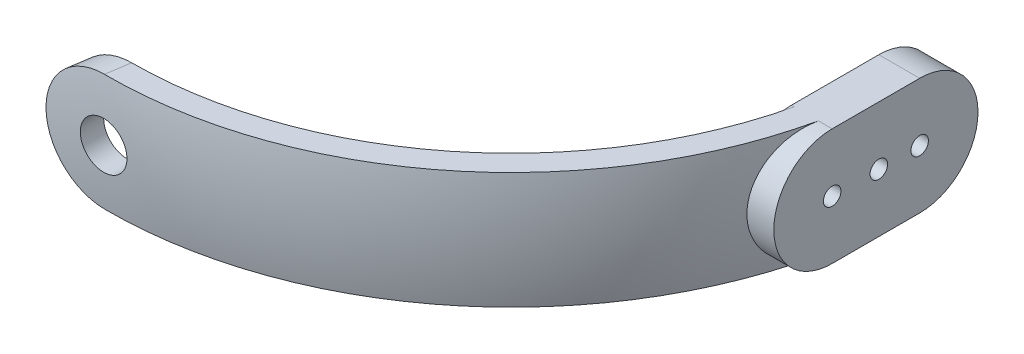
ISO-10303-21;
HEADER;
FILE_DESCRIPTION(('STEP AP214'),'2;1');
FILE_NAME('part.step','',(''),(''),'','','');
FILE_SCHEMA(('AUTOMOTIVE_DESIGN { 1 0 10303 214 1 1 1 1 }'));
ENDSEC;
DATA;
#1=APPLICATION_CONTEXT('core data for automotive mechanical design processes');
#2=APPLICATION_PROTOCOL_DEFINITION('international standard','automotive_design',2000,#1);
#3=PRODUCT_CONTEXT('',#1,'mechanical');
#4=PRODUCT('Part','Part','',(#3));
#5=PRODUCT_RELATED_PRODUCT_CATEGORY('part','',(#4));
#6=PRODUCT_DEFINITION_FORMATION('','',#4);
#7=PRODUCT_DEFINITION_CONTEXT('part definition',#1,'design');
#8=PRODUCT_DEFINITION('design','',#6,#7);
#9=PRODUCT_DEFINITION_SHAPE('','',#8);
#10=(LENGTH_UNIT() NAMED_UNIT(*) SI_UNIT(.MILLI.,.METRE.));
#11=(NAMED_UNIT(*) PLANE_ANGLE_UNIT() SI_UNIT($,.RADIAN.));
#12=(NAMED_UNIT(*) SI_UNIT($,.STERADIAN.) SOLID_ANGLE_UNIT());
#13=UNCERTAINTY_MEASURE_WITH_UNIT(LENGTH_MEASURE(1.E-05),#10,'distance_accuracy_value','');
#14=(GEOMETRIC_REPRESENTATION_CONTEXT(3) GLOBAL_UNCERTAINTY_ASSIGNED_CONTEXT((#13)) GLOBAL_UNIT_ASSIGNED_CONTEXT((#10,
#11,#12)) REPRESENTATION_CONTEXT('',''));
#15=CARTESIAN_POINT('',(0.,0.,0.));
#16=DIRECTION('',(0.,0.,1.));
#17=DIRECTION('',(1.,0.,0.));
#18=AXIS2_PLACEMENT_3D('',#15,#16,#17);
#19=CARTESIAN_POINT('',(0.,0.,0.));
#20=DIRECTION('',(0.,1.,0.));
#21=DIRECTION('',(-0.15093609829513,0.,0.988543521667834));
#22=AXIS2_PLACEMENT_3D('',#19,#20,#21);
#23=SPHERICAL_SURFACE('',#22,70.);
#24=CARTESIAN_POINT('',(0.,0.,69.8856208386246));
#25=DIRECTION('',(0.,0.,-1.));
#26=DIRECTION('',(-1.,0.,0.));
#27=AXIS2_PLACEMENT_3D('',#24,#25,#26);
#28=CIRCLE('',#27,4.);
#29=CARTESIAN_POINT('',(-4.,0.,69.8856208386246));
#30=VERTEX_POINT('',#29);
#31=EDGE_CURVE('E221',#30,#30,#28,.F.);
#32=ORIENTED_EDGE('',*,*,#31,.F.);
#33=EDGE_LOOP('',(#32));
#34=FACE_BOUND('',#33,.T.);
#35=CARTESIAN_POINT('',(0.,10.,0.));
#36=DIRECTION('',(0.,1.,0.));
#37=DIRECTION('',(0.,0.,1.));
#38=AXIS2_PLACEMENT_3D('',#35,#36,#37);
#39=CIRCLE('',#38,69.2820323027551);
#40=CARTESIAN_POINT('',(-0.462222349757554,10.,69.2804904031386));
#41=VERTEX_POINT('',#40);
#42=CARTESIAN_POINT('',(67.6387462923434,10.,15.));
#43=VERTEX_POINT('',#42);
#44=EDGE_CURVE('E266',#41,#43,#39,.T.);
#45=ORIENTED_EDGE('',*,*,#44,.F.);
#46=CARTESIAN_POINT('',(-0.462222349757555,10.,69.2804904031387));
#47=CARTESIAN_POINT('',(-0.74857650354653,10.0000286925321,69.2785802851065));
#48=CARTESIAN_POINT('',(-1.03492736409931,9.9879570873916,69.276632480057));
#49=CARTESIAN_POINT('',(-1.60559760221743,9.93981698833947,69.2726780503567));
#50=CARTESIAN_POINT('',(-1.8899170306699,9.90374909767695,69.2706714271856));
#51=CARTESIAN_POINT('',(-2.45438778821967,9.80784157775172,69.2666167253598));
#52=CARTESIAN_POINT('',(-2.73454092548084,9.74801259281153,69.2645686656569));
#53=CARTESIAN_POINT('',(-3.28881345082199,9.60498894641762,69.2604490513777));
#54=CARTESIAN_POINT('',(-3.56293294000753,9.52179467681688,69.2583774971961));
#55=CARTESIAN_POINT('',(-4.10334612246891,9.33253578777748,69.2542298282785));
#56=CARTESIAN_POINT('',(-4.36963501672429,9.22645746250886,69.2521537115506));
#57=CARTESIAN_POINT('',(-4.8923007422481,8.99217339722825,69.2480197021044));
#58=CARTESIAN_POINT('',(-5.14867741939638,8.86396731333192,69.2459618096697));
#59=CARTESIAN_POINT('',(-5.64958712455836,8.58633697903529,69.2418873430558));
#60=CARTESIAN_POINT('',(-5.89412322367634,8.43691827054122,69.2398707582416));
#61=CARTESIAN_POINT('',(-6.36963058025873,8.11786486008064,69.2359014841883));
#62=CARTESIAN_POINT('',(-6.60060197549959,7.94823036349858,69.2339487943003));
#63=CARTESIAN_POINT('',(-7.04616989228694,7.59080821221441,69.2301400508848));
#64=CARTESIAN_POINT('',(-7.2608417007182,7.4031144181893,69.2282835674533));
#65=CARTESIAN_POINT('',(-7.67347732906623,7.01018074537591,69.2246797004469));
#66=CARTESIAN_POINT('',(-7.87144130499456,6.80494103046098,69.2229323158534));
#67=CARTESIAN_POINT('',(-8.24922277899807,6.37831292920769,69.2195684004799));
#68=CARTESIAN_POINT('',(-8.42903661047277,6.15692129544051,69.2179518961526));
#69=CARTESIAN_POINT('',(-8.76911208245141,5.69960305655709,69.2148712052701));
#70=CARTESIAN_POINT('',(-8.92937419471069,5.46367680234749,69.2134070150399));
#71=CARTESIAN_POINT('',(-9.22769132204602,4.98130453584675,69.210663666848));
#72=CARTESIAN_POINT('',(-9.36594462555629,4.73498115398828,69.2093828685821));
#73=CARTESIAN_POINT('',(-9.62103507719537,4.23149199847189,69.2070069159865));
#74=CARTESIAN_POINT('',(-9.73787281590004,3.97432652404639,69.2059117565376));
#75=CARTESIAN_POINT('',(-9.94918842703858,3.45112985416824,69.2039224939133));
#76=CARTESIAN_POINT('',(-10.0436792317633,3.18510388852875,69.2030282744679));
#77=CARTESIAN_POINT('',(-10.2096413742647,2.64607741673166,69.2014526103822));
#78=CARTESIAN_POINT('',(-10.2811188794945,2.37307880041426,69.200771108736));
#79=CARTESIAN_POINT('',(-10.4154760218002,1.75297551875647,69.1994873857001));
#80=CARTESIAN_POINT('',(-10.47174302704,1.40440087487035,69.1989475386342));
#81=CARTESIAN_POINT('',(-10.5280065779751,0.878952504131412,69.1984072438888));
#82=CARTESIAN_POINT('',(-10.5420715882165,0.70346563603119,69.1982720586705));
#83=CARTESIAN_POINT('',(-10.5608309667409,0.351998912621783,69.1980916881762));
#84=CARTESIAN_POINT('',(-10.5655257207432,0.176019077903829,69.1980464991958));
#85=CARTESIAN_POINT('',(-10.5655268806591,0.,69.1980465167484));
#86=B_SPLINE_CURVE_WITH_KNOTS('',3,(#46,#47,#48,#49,#50,#51,#52,#53,#54,#55,#56,#57,#58,#59,#60,
#61,#62,#63,#64,#65,#66,#67,#68,#69,#70,#71,#72,#73,#74,#75,#76,#77,#78,#79,#80,#81,#82,#83,#84,
#85),.UNSPECIFIED.,.F.,.F.,(4,2,2,2,2,2,2,2,2,2,2,2,2,2,2,2,2,2,2,4),(0.,0.858823172845872,
1.71762475631812,2.57604205325981,3.43444495477242,4.29336340958799,5.15229521393402,
6.01100302951608,6.86970212170855,7.72415731840028,8.57860453562293,9.43322401994213,
10.2878228794212,11.1342233944494,11.9806005648238,12.8264867270403,13.6721460067976,
14.7291403804508,15.2570784616778,15.7849948102929),.UNSPECIFIED.);
#87=CARTESIAN_POINT('',(-10.5655268806591,0.,69.1980465167484));
#88=VERTEX_POINT('',#87);
#89=EDGE_CURVE('E52',#41,#88,#86,.T.);
#90=ORIENTED_EDGE('',*,*,#89,.T.);
#91=CARTESIAN_POINT('',(-10.5655268806591,0.,69.1980465167484));
#92=CARTESIAN_POINT('',(-10.56555885094,-0.279195742053648,69.1980459591196));
#93=CARTESIAN_POINT('',(-10.5537175385637,-0.558386122635912,69.1981600961945));
#94=CARTESIAN_POINT('',(-10.506519867728,-1.11475376492919,69.1986137228412));
#95=CARTESIAN_POINT('',(-10.4711651013557,-1.39193116165412,69.1989531971555));
#96=CARTESIAN_POINT('',(-10.3772205800763,-1.94202422561867,69.1998529969293));
#97=CARTESIAN_POINT('',(-10.3186548888968,-2.21494400329101,69.2004130936568));
#98=CARTESIAN_POINT('',(-10.1787392736321,-2.7548753116965,69.2017463134574));
#99=CARTESIAN_POINT('',(-10.0973895419045,-3.02188689228997,69.2025194347321));
#100=CARTESIAN_POINT('',(-9.91247788592469,-3.54821419126959,69.2042686115392));
#101=CARTESIAN_POINT('',(-9.80890775409456,-3.80752702556036,69.2052447420534));
#102=CARTESIAN_POINT('',(-9.58034244832357,-4.31653781584311,69.2073867157002));
#103=CARTESIAN_POINT('',(-9.45534671249735,-4.56623551946842,69.208552563808));
#104=CARTESIAN_POINT('',(-9.18487234284253,-5.05423855861267,69.2110584459147));
#105=CARTESIAN_POINT('',(-9.03939610987979,-5.29254522508798,69.2123984594953));
#106=CARTESIAN_POINT('',(-8.72901751498653,-5.75614929086359,69.2152354390561));
#107=CARTESIAN_POINT('',(-8.56411517995803,-5.98144670817897,69.2167324048189));
#108=CARTESIAN_POINT('',(-8.21532593638335,-6.41843842692268,69.2198711576958));
#109=CARTESIAN_POINT('',(-8.03135963906008,-6.63006935700408,69.2215135459026));
#110=CARTESIAN_POINT('',(-7.64637584813791,-7.03720732190885,69.2249170985582));
#111=CARTESIAN_POINT('',(-7.44535820731701,-7.23271421748789,69.2266782640324));
#112=CARTESIAN_POINT('',(-7.02767655392824,-7.60631779270132,69.2302984251191));
#113=CARTESIAN_POINT('',(-6.81100938448425,-7.78441094242558,69.2321574404495));
#114=CARTESIAN_POINT('',(-6.36361168842842,-8.12194800311324,69.2359511791269));
#115=CARTESIAN_POINT('',(-6.13288126610644,-8.28139205234848,69.2378859019125));
#116=CARTESIAN_POINT('',(-5.6566770653641,-8.58203192169401,69.2418283293358));
#117=CARTESIAN_POINT('',(-5.41108178679297,-8.72303531796224,69.2438365605461));
#118=CARTESIAN_POINT('',(-4.90896645329344,-8.98400984627056,69.2478857765348));
#119=CARTESIAN_POINT('',(-4.65244642050334,-9.10398102092855,69.2499267612468));
#120=CARTESIAN_POINT('',(-4.13036700537066,-9.32206246688595,69.2540194270667));
#121=CARTESIAN_POINT('',(-3.86481070242983,-9.42018010116109,69.2560711043329));
#122=CARTESIAN_POINT('',(-3.32655316091743,-9.59393923560758,69.2601645924789));
#123=CARTESIAN_POINT('',(-3.05385346080841,-9.66958553278653,69.2622064053728));
#124=CARTESIAN_POINT('',(-2.39890233194909,-9.82220034856652,69.2670289312936));
#125=CARTESIAN_POINT('',(-2.0141763378144,-9.8888764721364,69.2697974430552));
#126=CARTESIAN_POINT('',(-1.43379578185281,-9.95554157837941,69.2738722603518));
#127=CARTESIAN_POINT('',(-1.23989570506313,-9.97220508618648,69.2752168152349));
#128=CARTESIAN_POINT('',(-0.851422076173815,-9.99443405844159,69.2778766586965));
#129=CARTESIAN_POINT('',(-0.65684839981741,-9.99999735252477,69.279191941502));
#130=CARTESIAN_POINT('',(-0.462222349757552,-10.,69.2804904031386));
#131=B_SPLINE_CURVE_WITH_KNOTS('',3,(#91,#92,#93,#94,#95,#96,#97,#98,#99,#100,#101,#102,#103,
#104,#105,#106,#107,#108,#109,#110,#111,#112,#113,#114,#115,#116,#117,#118,#119,#120,#121,#122,
#123,#124,#125,#126,#127,#128,#129,#130),.UNSPECIFIED.,.F.,.F.,(4,2,2,2,2,2,2,2,2,2,2,2,2,2,2,2,
2,2,2,4),(0.,0.837328453318807,1.67460021721983,2.5110062079968,3.34740513750275,
4.1841135422934,5.02084389307685,5.85747623807694,6.69410742448934,7.53437444077184,
8.37464871269245,9.21509296355816,10.0555309826405,10.9041375489006,11.7527423955968,
12.6010608932382,13.4491981680415,14.6176814847377,15.201274659454,15.7849819298151),.UNSPECIFIED.);
#132=CARTESIAN_POINT('',(-0.462222349757552,-10.,69.2804904031386));
#133=VERTEX_POINT('',#132);
#134=EDGE_CURVE('E59',#88,#133,#131,.T.);
#135=ORIENTED_EDGE('',*,*,#134,.T.);
#136=CARTESIAN_POINT('',(0.,-10.,0.));
#137=DIRECTION('',(0.,1.,0.));
#138=DIRECTION('',(0.,0.,1.));
#139=AXIS2_PLACEMENT_3D('',#136,#137,#138);
#140=CIRCLE('',#139,69.2820323027551);
#141=CARTESIAN_POINT('',(67.6387462923434,-10.,15.));
#142=VERTEX_POINT('',#141);
#143=EDGE_CURVE('E276',#133,#142,#140,.T.);
#144=ORIENTED_EDGE('',*,*,#143,.T.);
#145=CARTESIAN_POINT('',(67.6387906456051,9.999999998,14.9998));
#146=CARTESIAN_POINT('',(67.5752331407052,10.0000322503732,15.2864009544086));
#147=CARTESIAN_POINT('',(67.5115890915751,9.98769153291414,15.5729801402053));
#148=CARTESIAN_POINT('',(67.3845791435497,9.93846448780668,16.1440831200388));
#149=CARTESIAN_POINT('',(67.3212132429142,9.90157831393849,16.4286069269414));
#150=CARTESIAN_POINT('',(67.1952114408887,9.80346178505663,16.9935845778318));
#151=CARTESIAN_POINT('',(67.1325755231003,9.74223197798377,17.2740385132793));
#152=CARTESIAN_POINT('',(67.008486676519,9.59581776895555,17.8288853530287));
#153=CARTESIAN_POINT('',(66.9470337248238,9.51063383125067,18.1032783746849));
#154=CARTESIAN_POINT('',(66.8257208384161,9.31677207279039,18.6442239014171));
#155=CARTESIAN_POINT('',(66.7658620261363,9.20807816551259,18.9107708953237));
#156=CARTESIAN_POINT('',(66.6482326661693,8.96791486138046,19.4338847288658));
#157=CARTESIAN_POINT('',(66.5904621374081,8.83644525817233,19.6904514780518));
#158=CARTESIAN_POINT('',(66.477477189564,8.55162293357646,20.19160724317));
#159=CARTESIAN_POINT('',(66.4222618779889,8.39827793045794,20.4362004430033));
#160=CARTESIAN_POINT('',(66.314805571261,8.07067251443423,20.9116483065956));
#161=CARTESIAN_POINT('',(66.2625645313162,7.89641241662903,21.1425031772533));
#162=CARTESIAN_POINT('',(66.1620224311325,7.53010158108634,21.5863096243991));
#163=CARTESIAN_POINT('',(66.1136853586256,7.33825990222363,21.7994255802421));
#164=CARTESIAN_POINT('',(66.0207422627567,6.9365377654764,22.2087917062881));
#165=CARTESIAN_POINT('',(65.9761360682685,6.72665813584383,22.4050426500583));
#166=CARTESIAN_POINT('',(65.8910281986225,6.29027631054148,22.779140489626));
#167=CARTESIAN_POINT('',(65.8505269425567,6.06377242168659,22.9569855063168));
#168=CARTESIAN_POINT('',(65.7739900939299,5.59576463476826,23.2927897422625));
#169=CARTESIAN_POINT('',(65.7379544130136,5.35426103362917,23.4507493549684));
#170=CARTESIAN_POINT('',(65.6714700955934,4.86388232045742,23.7419698270609));
#171=CARTESIAN_POINT('',(65.6409094320029,4.61531686057884,23.8757266792528));
#172=CARTESIAN_POINT('',(65.5846241221677,4.10731969320898,24.1219290444975));
#173=CARTESIAN_POINT('',(65.5588994057171,3.84788814353274,24.2343748669329));
#174=CARTESIAN_POINT('',(65.5125222639979,3.32008259309335,24.4369988243938));
#175=CARTESIAN_POINT('',(65.4918689390226,3.05171018811962,24.5271809092047));
#176=CARTESIAN_POINT('',(65.4558188942526,2.50795796577001,24.684536609506));
#177=CARTESIAN_POINT('',(65.440422097742,2.23257825072444,24.7517105607858));
#178=CARTESIAN_POINT('',(65.4153164532246,1.68317082552644,24.861217578573));
#179=CARTESIAN_POINT('',(65.4054866486933,1.4092538205996,24.9040789315538));
#180=CARTESIAN_POINT('',(65.3910736907363,0.858672376905289,24.9669177913781));
#181=CARTESIAN_POINT('',(65.3864904514502,0.582007983173784,24.9868956727113));
#182=CARTESIAN_POINT('',(65.3826121998032,0.0279528802366646,25.0038008570546));
#183=CARTESIAN_POINT('',(65.3833169281266,-0.249437792686192,25.0007292903832));
#184=CARTESIAN_POINT('',(65.3900075911905,-0.802941839245069,24.9715639457553));
#185=CARTESIAN_POINT('',(65.3959935101577,-1.07905521669354,24.9454702365596));
#186=CARTESIAN_POINT('',(65.4131003253558,-1.62507148319349,24.8708792625615));
#187=CARTESIAN_POINT('',(65.4241657770223,-1.89500920130382,24.8226238960599));
#188=CARTESIAN_POINT('',(65.4513148559344,-2.42976956067239,24.7041855888502));
#189=CARTESIAN_POINT('',(65.4673984343362,-2.69459225169114,24.6340028615722));
#190=CARTESIAN_POINT('',(65.5044437136053,-3.21727837511196,24.4722732196547));
#191=CARTESIAN_POINT('',(65.5254054079686,-3.47514181679234,24.3807263335002));
#192=CARTESIAN_POINT('',(65.5720273364005,-3.98214140437159,24.176992463792));
#193=CARTESIAN_POINT('',(65.5976876084625,-4.23127747968027,24.0648053133382));
#194=CARTESIAN_POINT('',(65.6536667329688,-4.72067865614998,23.8198944127446));
#195=CARTESIAN_POINT('',(65.6840139027831,-4.96087801861172,23.6870457930934));
#196=CARTESIAN_POINT('',(65.7489948953507,-5.42913135074184,23.4023575114328));
#197=CARTESIAN_POINT('',(65.7836287256725,-5.65718529896489,23.2505178158922));
#198=CARTESIAN_POINT('',(65.856894190623,-6.09961313422761,22.9290276228508));
#199=CARTESIAN_POINT('',(65.895524992443,-6.3139898560648,22.7593808355284));
#200=CARTESIAN_POINT('',(65.9765028531039,-6.72784125569001,22.403423696271));
#201=CARTESIAN_POINT('',(66.0188515654572,-6.92730922916587,22.2171059293308));
#202=CARTESIAN_POINT('',(66.1077942861728,-7.31377488817353,21.8253850161225));
#203=CARTESIAN_POINT('',(66.1544555414807,-7.50044910499342,21.6196779692973));
#204=CARTESIAN_POINT('',(66.250906963331,-7.85565571097648,21.1939883635903));
#205=CARTESIAN_POINT('',(66.3006958937252,-8.02419519694892,20.9740114434688));
#206=CARTESIAN_POINT('',(66.4030761260201,-8.34228176026005,20.5211367521153));
#207=CARTESIAN_POINT('',(66.4556691548122,-8.49181693754077,20.28823101501));
#208=CARTESIAN_POINT('',(66.5632418967376,-8.77086925287492,19.8112573626838));
#209=CARTESIAN_POINT('',(66.61822157315,-8.90038669878027,19.5671896191976));
#210=CARTESIAN_POINT('',(66.7315702777814,-9.14161012393942,19.0633606345126));
#211=CARTESIAN_POINT('',(66.7899896026032,-9.25279267896344,18.8033600056532));
#212=CARTESIAN_POINT('',(66.9084966092774,-9.45265328741318,18.2752197388272));
#213=CARTESIAN_POINT('',(66.9685842907796,-9.54133134556227,18.0070801025688));
#214=CARTESIAN_POINT('',(67.0899262964439,-9.69556012017206,17.4648488830921));
#215=CARTESIAN_POINT('',(67.1511791850682,-9.76113756921273,17.1907645718787));
#216=CARTESIAN_POINT('',(67.2744685921068,-9.86889281332675,16.6383224230693));
#217=CARTESIAN_POINT('',(67.3365047301163,-9.91108155202142,16.3599666468631));
#218=CARTESIAN_POINT('',(67.4386870263965,-9.96098085354645,15.9008363615147));
#219=CARTESIAN_POINT('',(67.4787278232277,-9.9756258443334,15.7207630983444));
#220=CARTESIAN_POINT('',(67.5587859474802,-9.99512985555244,15.3604014830896));
#221=CARTESIAN_POINT('',(67.5988032007761,-10.0000053225872,15.180114004599));
#222=CARTESIAN_POINT('',(67.6387906456051,-9.999999998,14.9998));
#223=B_SPLINE_CURVE_WITH_KNOTS('',3,(#145,#146,#147,#148,#149,#150,#151,#152,#153,#154,#155,
#156,#157,#158,#159,#160,#161,#162,#163,#164,#165,#166,#167,#168,#169,#170,#171,#172,#173,#174,
#175,#176,#177,#178,#179,#180,#181,#182,#183,#184,#185,#186,#187,#188,#189,#190,#191,#192,#193,
#194,#195,#196,#197,#198,#199,#200,#201,#202,#203,#204,#205,#206,#207,#208,#209,#210,#211,#212,
#213,#214,#215,#216,#217,#218,#219,#220,#221,#222),.UNSPECIFIED.,.F.,.F.,(4,2,2,2,2,2,2,2,2,2,2,
2,2,2,2,2,2,2,2,2,2,2,2,2,2,2,2,2,2,2,2,2,2,2,2,2,2,2,4),(0.,0.8804282159409,1.76085091594467,
2.64125379999821,3.52163962230565,4.40262975857964,5.28362787727367,6.16431591982775,
7.04499069588823,7.91629351320544,8.78755634410147,9.65890803681556,10.5302424863239,
11.380958866105,12.2316628946799,13.0822158921565,13.9327564758184,14.7640283281322,
15.5952865764228,16.426504061033,17.2577190630367,18.0800692865142,18.9024115058907,
19.7247526288389,20.5471004016536,21.3746264558922,22.2021539712574,23.029509408941,
23.8572346889796,24.7012821355226,25.5449980636021,26.3892397309405,27.2334684134274,
28.0987050477059,28.9639415003843,29.8281733657042,30.6920005132845,31.2469163161261,
31.800897152914),.UNSPECIFIED.);
#224=EDGE_CURVE('E212',#43,#142,#223,.T.);
#225=ORIENTED_EDGE('',*,*,#224,.F.);
#226=EDGE_LOOP('',(#45,#90,#135,#144,#225));
#227=FACE_BOUND('',#226,.T.);
#228=ADVANCED_FACE('F41',(#34,#227),#23,.T.);
#229=CARTESIAN_POINT('',(0.,0.,0.));
#230=DIRECTION('',(0.,1.,0.));
#231=DIRECTION('',(-0.15093609829513,0.,0.988543521667834));
#232=AXIS2_PLACEMENT_3D('',#229,#230,#231);
#233=SPHERICAL_SURFACE('',#232,66.);
#234=CARTESIAN_POINT('',(0.,0.,65.8786763680024));
#235=DIRECTION('',(0.,0.,-1.));
#236=DIRECTION('',(-1.,0.,0.));
#237=AXIS2_PLACEMENT_3D('',#234,#235,#236);
#238=CIRCLE('',#237,4.);
#239=CARTESIAN_POINT('',(-4.,0.,65.8786763680024));
#240=VERTEX_POINT('',#239);
#241=EDGE_CURVE('E220',#240,#240,#238,.T.);
#242=ORIENTED_EDGE('',*,*,#241,.F.);
#243=EDGE_LOOP('',(#242));
#244=FACE_BOUND('',#243,.T.);
#245=CARTESIAN_POINT('',(0.155030848198938,-10.,65.2378415142325));
#246=CARTESIAN_POINT('',(-0.131986569335951,-10.0000284913395,65.2385240203259));
#247=CARTESIAN_POINT('',(-0.419001259192178,-9.98793459252138,65.2391611501055));
#248=CARTESIAN_POINT('',(-0.990997575398194,-9.93970338125491,65.2403435555508));
#249=CARTESIAN_POINT('',(-1.27597924618595,-9.90356659597637,65.24088883323));
#250=CARTESIAN_POINT('',(-1.84177973462102,-9.8074704844296,65.2418862603803));
#251=CARTESIAN_POINT('',(-2.12260019629965,-9.74752084145832,65.2423384475925));
#252=CARTESIAN_POINT('',(-2.67819557862285,-9.60420179998204,65.2431518981182));
#253=CARTESIAN_POINT('',(-2.95297060460921,-9.52083280990861,65.2435131630171));
#254=CARTESIAN_POINT('',(-3.49468195173032,-9.33116488637958,65.2441489334695));
#255=CARTESIAN_POINT('',(-3.76161332339081,-9.22485181346933,65.2444233852653));
#256=CARTESIAN_POINT('',(-4.28553735031657,-8.99003593648883,65.2448912359336));
#257=CARTESIAN_POINT('',(-4.54252985851906,-8.86153280423168,65.2450846336071));
#258=CARTESIAN_POINT('',(-5.04463215185802,-8.58324438227477,65.245398059599));
#259=CARTESIAN_POINT('',(-5.2897451421963,-8.43346487649105,65.2455181078104));
#260=CARTESIAN_POINT('',(-5.76635882402965,-8.1136226917393,65.245694079448));
#261=CARTESIAN_POINT('',(-5.99785966293478,-7.94356023248187,65.2457500035688));
#262=CARTESIAN_POINT('',(-6.44427217878354,-7.5853383986953,65.2458078273071));
#263=CARTESIAN_POINT('',(-6.65926976774226,-7.39728608976542,65.2458100287483));
#264=CARTESIAN_POINT('',(-7.07250753774296,-7.00359289940035,65.2457719847672));
#265=CARTESIAN_POINT('',(-7.2707478958306,-6.79795220383844,65.2457317397934));
#266=CARTESIAN_POINT('',(-7.64902160737295,-6.37048021719419,65.2456199491493));
#267=CARTESIAN_POINT('',(-7.82905128811324,-6.14864567562023,65.2455483971804));
#268=CARTESIAN_POINT('',(-8.16948607065196,-5.69040288311482,65.2453851254496));
#269=CARTESIAN_POINT('',(-8.32989166851103,-5.45399500079784,65.2452934061977));
#270=CARTESIAN_POINT('',(-8.62822354340273,-4.97093462774262,65.2451015670682));
#271=CARTESIAN_POINT('',(-8.76637469003329,-4.72442100203983,65.2450015490541));
#272=CARTESIAN_POINT('',(-9.02122362845214,-4.22055194684976,65.2448019032622));
#273=CARTESIAN_POINT('',(-9.13792204144496,-3.96319683156367,65.2447022754732));
#274=CARTESIAN_POINT('',(-9.34891444220658,-3.43962860308937,65.244512039188));
#275=CARTESIAN_POINT('',(-9.4432217271022,-3.17342085473377,65.2444214253575));
#276=CARTESIAN_POINT('',(-9.60876956364805,-2.63403950533049,65.2442563670635));
#277=CARTESIAN_POINT('',(-9.68001637657998,-2.36086781686939,65.2441819182128));
#278=CARTESIAN_POINT('',(-9.81332627281469,-1.74258041716103,65.2440394550007));
#279=CARTESIAN_POINT('',(-9.86899535685468,-1.3960509519285,65.243977356873));
#280=CARTESIAN_POINT('',(-9.92466096882778,-0.873712268508552,65.2439147031807));
#281=CARTESIAN_POINT('',(-9.93857648987245,-0.699268995404316,65.2438989011799));
#282=CARTESIAN_POINT('',(-9.95713652663224,-0.349896640219749,65.2438777487445));
#283=CARTESIAN_POINT('',(-9.96178139916246,-0.174967577096355,65.2438723979076));
#284=CARTESIAN_POINT('',(-9.96178248747855,0.,65.243872430077));
#285=B_SPLINE_CURVE_WITH_KNOTS('',3,(#245,#246,#247,#248,#249,#250,#251,#252,#253,#254,#255,
#256,#257,#258,#259,#260,#261,#262,#263,#264,#265,#266,#267,#268,#269,#270,#271,#272,#273,#274,
#275,#276,#277,#278,#279,#280,#281,#282,#283,#284),.UNSPECIFIED.,.F.,.F.,(4,2,2,2,2,2,2,2,2,2,2,
2,2,2,2,2,2,2,2,4),(0.,0.860796251592898,1.72157362979437,2.58200133791181,3.44241404116955,
4.30335850172651,5.1643156965845,6.02503928922227,6.88575355910904,7.74163106155167,
8.59749952023613,9.45354024705072,10.3095593302602,11.1562972602472,12.0030106674709,
12.8492199832956,13.6951993468362,14.7458870851157,15.2706715487443,15.7954358137174),.UNSPECIFIED.);
#286=CARTESIAN_POINT('',(0.155030848198938,-10.,65.2378415142324));
#287=VERTEX_POINT('',#286);
#288=CARTESIAN_POINT('',(-9.96178248747855,0.,65.243872430077));
#289=VERTEX_POINT('',#288);
#290=EDGE_CURVE('E256',#287,#289,#285,.T.);
#291=ORIENTED_EDGE('',*,*,#290,.T.);
#292=CARTESIAN_POINT('',(-9.96178248747855,0.,65.2438724300771));
#293=CARTESIAN_POINT('',(-9.96181466747956,0.278940842340204,65.2438720962864));
#294=CARTESIAN_POINT('',(-9.94997946035567,0.557876201340087,65.2438859205861));
#295=CARTESIAN_POINT('',(-9.90280737896208,1.11373374132184,65.2439394698494));
#296=CARTESIAN_POINT('',(-9.86747215181665,1.39065606202314,65.2439791929976));
#297=CARTESIAN_POINT('',(-9.77358321617826,1.94023148001082,65.2440820701314));
#298=CARTESIAN_POINT('',(-9.71505433328315,2.21288881906188,65.2441451990597));
#299=CARTESIAN_POINT('',(-9.57523155844215,2.75229901026998,65.2442902274762));
#300=CARTESIAN_POINT('',(-9.49393784837466,3.01905190958185,65.2443721268143));
#301=CARTESIAN_POINT('',(-9.3091620521541,3.54486496438026,65.2445485883736));
#302=CARTESIAN_POINT('',(-9.20567205139603,3.8039223382363,65.2446431551071));
#303=CARTESIAN_POINT('',(-8.97729382338616,4.31243349146452,65.2448373406838));
#304=CARTESIAN_POINT('',(-8.85240502194532,4.56188701291874,65.2449369596624));
#305=CARTESIAN_POINT('',(-8.58217385743261,5.0494205553219,65.2451324944087));
#306=CARTESIAN_POINT('',(-8.43683372682257,5.28750181386964,65.2452284105792));
#307=CARTESIAN_POINT('',(-8.12676048841517,5.75067893429696,65.2454069332885));
#308=CARTESIAN_POINT('',(-7.96202739845332,5.97577480811879,65.2454895398394));
#309=CARTESIAN_POINT('',(-7.61352209727317,6.41250841794704,65.2456316081193));
#310=CARTESIAN_POINT('',(-7.42966112791638,6.6240753239946,65.2456909552498));
#311=CARTESIAN_POINT('',(-7.04490726735715,7.03111006325763,65.2457753627673));
#312=CARTESIAN_POINT('',(-6.84401421134136,7.22657774065056,65.2458004228225));
#313=CARTESIAN_POINT('',(-6.42660265327214,7.60013583245859,65.2458057928831));
#314=CARTESIAN_POINT('',(-6.21008100754303,7.7782227337073,65.2457860938609));
#315=CARTESIAN_POINT('',(-5.76299464085298,8.11578958263127,65.2456919114394));
#316=CARTESIAN_POINT('',(-5.53243001074876,8.27526965067145,65.2456174283944));
#317=CARTESIAN_POINT('',(-5.05629962380173,8.57620888849808,65.2454032779811));
#318=CARTESIAN_POINT('',(-4.81059784838191,8.71745289880992,65.2452629095921));
#319=CARTESIAN_POINT('',(-4.30825970580585,8.97892072416353,65.244908358283));
#320=CARTESIAN_POINT('',(-4.05162334565797,9.09914455267762,65.2446941754102));
#321=CARTESIAN_POINT('',(-3.52929696831077,9.31775082223606,65.2441850900861));
#322=CARTESIAN_POINT('',(-3.26360988825486,9.4161402725439,65.2438902136072));
#323=CARTESIAN_POINT('',(-2.72507820158132,9.59046553118488,65.2432147077858));
#324=CARTESIAN_POINT('',(-2.45223511166069,9.6664060563007,65.242834096487));
#325=CARTESIAN_POINT('',(-1.79465113278134,9.82028339393431,65.241819075957));
#326=CARTESIAN_POINT('',(-1.40736450212402,9.88767922000608,65.2411434079665));
#327=CARTESIAN_POINT('',(-0.823093420898848,9.95506305160787,65.2400008235725));
#328=CARTESIAN_POINT('',(-0.627888644490238,9.97190599689586,65.2395987069164));
#329=CARTESIAN_POINT('',(-0.236796753400397,9.99437416967837,65.2387518937189));
#330=CARTESIAN_POINT('',(-0.0409095143919773,9.99999723324404,65.238307188981));
#331=CARTESIAN_POINT('',(0.155030848198938,10.,65.2378415142324));
#332=B_SPLINE_CURVE_WITH_KNOTS('',3,(#292,#293,#294,#295,#296,#297,#298,#299,#300,#301,#302,
#303,#304,#305,#306,#307,#308,#309,#310,#311,#312,#313,#314,#315,#316,#317,#318,#319,#320,#321,
#322,#323,#324,#325,#326,#327,#328,#329,#330,#331),.UNSPECIFIED.,.F.,.F.,(4,2,2,2,2,2,2,2,2,2,2,
2,2,2,2,2,2,2,2,4),(0.,0.836563611971917,1.67306859509867,2.5086806234291,3.3442859758712,
4.18018977971726,5.01611601668938,5.85195107485422,6.68778536431542,7.52768750976999,
8.36759778358281,9.20767747789561,10.0477517375531,10.8969743596407,11.7461964374392,
12.5951455026679,13.4439160667424,14.6202628874638,15.2077854461103,15.7954213066794),.UNSPECIFIED.);
#333=CARTESIAN_POINT('',(0.155030848198938,10.,65.2378415142324));
#334=VERTEX_POINT('',#333);
#335=EDGE_CURVE('E249',#289,#334,#332,.T.);
#336=ORIENTED_EDGE('',*,*,#335,.T.);
#337=CARTESIAN_POINT('',(0.,10.,0.));
#338=DIRECTION('',(0.,1.,0.));
#339=DIRECTION('',(0.,0.,1.));
#340=AXIS2_PLACEMENT_3D('',#337,#338,#339);
#341=CIRCLE('',#340,65.2380257212004);
#342=CARTESIAN_POINT('',(63.4901567173999,10.,15.));
#343=VERTEX_POINT('',#342);
#344=EDGE_CURVE('E272',#334,#343,#341,.T.);
#345=ORIENTED_EDGE('',*,*,#344,.T.);
#346=CARTESIAN_POINT('',(62.9998,9.78393664067803,17.0675066653334));
#347=CARTESIAN_POINT('',(63.0403057915496,9.81988976708498,16.8973834537628));
#348=CARTESIAN_POINT('',(63.0809861320086,9.85139081140113,16.7263619224889));
#349=CARTESIAN_POINT('',(63.1624846389781,9.90536353908831,16.3834062063914));
#350=CARTESIAN_POINT('',(63.2033021853856,9.92785814822551,16.2114754822059));
#351=CARTESIAN_POINT('',(63.2850724421001,9.96387752786716,15.8667092527406));
#352=CARTESIAN_POINT('',(63.3260251523109,9.97740230475875,15.6938737481052));
#353=CARTESIAN_POINT('',(63.4080658158232,9.9954784533942,15.3472960271535));
#354=CARTESIAN_POINT('',(63.4491538463237,10.0000066877081,15.1735526221773));
#355=CARTESIAN_POINT('',(63.4902039688014,9.999999998,14.9998));
#356=B_SPLINE_CURVE_WITH_KNOTS('',3,(#346,#347,#348,#349,#350,#351,#352,#353,#354,#355),
.UNSPECIFIED.,.F.,.F.,(4,2,2,2,4),(0.,0.53555019400675,1.06972835000409,1.60390612562856,
2.13945593765457),.UNSPECIFIED.);
#357=CARTESIAN_POINT('',(63.,9.78411410853781,17.0666666666667));
#358=VERTEX_POINT('',#357);
#359=EDGE_CURVE('E184',#358,#343,#356,.T.);
#360=ORIENTED_EDGE('',*,*,#359,.F.);
#361=CARTESIAN_POINT('',(63.,0.,0.));
#362=DIRECTION('',(1.,0.,0.));
#363=DIRECTION('',(0.,0.,-1.));
#364=AXIS2_PLACEMENT_3D('',#361,#362,#363);
#365=CIRCLE('',#364,19.6723155729061);
#366=CARTESIAN_POINT('',(63.,-9.78411410853781,17.0666666666667));
#367=VERTEX_POINT('',#366);
#368=EDGE_CURVE('E263',#367,#358,#365,.F.);
#369=ORIENTED_EDGE('',*,*,#368,.F.);
#370=CARTESIAN_POINT('',(63.4902039688014,-9.999999998,14.9998));
#371=CARTESIAN_POINT('',(63.4491538463237,-10.0000066877081,15.1735526221773));
#372=CARTESIAN_POINT('',(63.4080658158232,-9.9954784533942,15.3472960271535));
#373=CARTESIAN_POINT('',(63.3260251523109,-9.97740230475875,15.6938737481052));
#374=CARTESIAN_POINT('',(63.2850724421001,-9.96387752786716,15.8667092527406));
#375=CARTESIAN_POINT('',(63.2033021853856,-9.92785814822551,16.2114754822059));
#376=CARTESIAN_POINT('',(63.1624846389781,-9.90536353908831,16.3834062063914));
#377=CARTESIAN_POINT('',(63.0809861320086,-9.85139081140113,16.7263619224889));
#378=CARTESIAN_POINT('',(63.0403057915496,-9.81988976708498,16.8973834537628));
#379=CARTESIAN_POINT('',(62.9998,-9.78393664067802,17.0675066653334));
#380=B_SPLINE_CURVE_WITH_KNOTS('',3,(#370,#371,#372,#373,#374,#375,#376,#377,#378,#379),
.UNSPECIFIED.,.F.,.F.,(4,2,2,2,4),(0.,0.53554981202601,1.06972758765048,1.60390574364782,
2.13945593765457),.UNSPECIFIED.);
#381=CARTESIAN_POINT('',(63.4901567173999,-10.,15.));
#382=VERTEX_POINT('',#381);
#383=EDGE_CURVE('E122',#382,#367,#380,.T.);
#384=ORIENTED_EDGE('',*,*,#383,.F.);
#385=CARTESIAN_POINT('',(0.,-10.,0.));
#386=DIRECTION('',(0.,1.,0.));
#387=DIRECTION('',(0.,0.,1.));
#388=AXIS2_PLACEMENT_3D('',#385,#386,#387);
#389=CIRCLE('',#388,65.2380257212004);
#390=EDGE_CURVE('E136',#287,#382,#389,.T.);
#391=ORIENTED_EDGE('',*,*,#390,.F.);
#392=EDGE_LOOP('',(#291,#336,#345,#360,#369,#384,#391));
#393=FACE_BOUND('',#392,.T.);
#394=ADVANCED_FACE('F199',(#244,#393),#233,.F.);
#395=CARTESIAN_POINT('',(-9.84677306283529,10.,64.4906276930922));
#396=DIRECTION('',(0.,-1.,0.));
#397=DIRECTION('',(0.,0.,-1.));
#398=AXIS2_PLACEMENT_3D('',#395,#396,#397);
#399=PLANE('',#398);
#400=ORIENTED_EDGE('',*,*,#344,.F.);
#401=DIRECTION('',(0.15093609829513,0.,-0.988543521667834));
#402=VECTOR('',#401,1.);
#403=CARTESIAN_POINT('',(-0.571724421056649,10.,69.9976651838215));
#404=LINE('',#403,#402);
#405=EDGE_CURVE('E236',#334,#41,#404,.F.);
#406=ORIENTED_EDGE('',*,*,#405,.T.);
#407=ORIENTED_EDGE('',*,*,#44,.T.);
#408=DIRECTION('',(1.,0.,0.));
#409=VECTOR('',#408,1.);
#410=CARTESIAN_POINT('',(63.,10.,15.));
#411=LINE('',#410,#409);
#412=CARTESIAN_POINT('',(70.,10.,15.));
#413=VERTEX_POINT('',#412);
#414=EDGE_CURVE('E178',#43,#413,#411,.T.);
#415=ORIENTED_EDGE('',*,*,#414,.T.);
#416=DIRECTION('',(0.,0.,1.));
#417=VECTOR('',#416,1.);
#418=CARTESIAN_POINT('',(70.,10.,15.));
#419=LINE('',#418,#417);
#420=CARTESIAN_POINT('',(70.,10.,0.));
#421=VERTEX_POINT('',#420);
#422=EDGE_CURVE('E128',#421,#413,#419,.T.);
#423=ORIENTED_EDGE('',*,*,#422,.F.);
#424=DIRECTION('',(1.,0.,0.));
#425=VECTOR('',#424,1.);
#426=CARTESIAN_POINT('',(63.,10.,0.));
#427=LINE('',#426,#425);
#428=CARTESIAN_POINT('',(63.,10.,0.));
#429=VERTEX_POINT('',#428);
#430=EDGE_CURVE('E179',#429,#421,#427,.T.);
#431=ORIENTED_EDGE('',*,*,#430,.F.);
#432=DIRECTION('',(0.,0.,1.));
#433=VECTOR('',#432,1.);
#434=CARTESIAN_POINT('',(63.,10.,15.));
#435=LINE('',#434,#433);
#436=CARTESIAN_POINT('',(63.,10.,15.));
#437=VERTEX_POINT('',#436);
#438=EDGE_CURVE('E150',#429,#437,#435,.T.);
#439=ORIENTED_EDGE('',*,*,#438,.T.);
#440=EDGE_CURVE('E174',#437,#343,#411,.T.);
#441=ORIENTED_EDGE('',*,*,#440,.T.);
#442=EDGE_LOOP('',(#400,#406,#407,#415,#423,#431,#439,#441));
#443=FACE_BOUND('',#442,.T.);
#444=ADVANCED_FACE('F247',(#443),#399,.F.);
#445=CARTESIAN_POINT('',(-10.457159637735,-10.,68.4883042008701));
#446=DIRECTION('',(0.,1.,0.));
#447=DIRECTION('',(0.,0.,1.));
#448=AXIS2_PLACEMENT_3D('',#445,#446,#447);
#449=PLANE('',#448);
#450=ORIENTED_EDGE('',*,*,#143,.F.);
#451=DIRECTION('',(-0.15093609829513,0.,0.988543521667834));
#452=VECTOR('',#451,1.);
#453=CARTESIAN_POINT('',(0.038662153843046,-10.,65.9999886760435));
#454=LINE('',#453,#452);
#455=EDGE_CURVE('E11',#133,#287,#454,.F.);
#456=ORIENTED_EDGE('',*,*,#455,.T.);
#457=ORIENTED_EDGE('',*,*,#390,.T.);
#458=DIRECTION('',(1.,0.,0.));
#459=VECTOR('',#458,1.);
#460=CARTESIAN_POINT('',(63.,-10.,15.));
#461=LINE('',#460,#459);
#462=CARTESIAN_POINT('',(63.,-10.,15.));
#463=VERTEX_POINT('',#462);
#464=EDGE_CURVE('E121',#463,#382,#461,.T.);
#465=ORIENTED_EDGE('',*,*,#464,.F.);
#466=DIRECTION('',(0.,0.,-1.));
#467=VECTOR('',#466,1.);
#468=CARTESIAN_POINT('',(63.,-10.,15.));
#469=LINE('',#468,#467);
#470=CARTESIAN_POINT('',(63.,-10.,0.));
#471=VERTEX_POINT('',#470);
#472=EDGE_CURVE('E134',#463,#471,#469,.T.);
#473=ORIENTED_EDGE('',*,*,#472,.T.);
#474=DIRECTION('',(1.,0.,0.));
#475=VECTOR('',#474,1.);
#476=CARTESIAN_POINT('',(63.,-10.,0.));
#477=LINE('',#476,#475);
#478=CARTESIAN_POINT('',(70.,-10.,0.));
#479=VERTEX_POINT('',#478);
#480=EDGE_CURVE('E138',#471,#479,#477,.T.);
#481=ORIENTED_EDGE('',*,*,#480,.T.);
#482=DIRECTION('',(0.,0.,-1.));
#483=VECTOR('',#482,1.);
#484=CARTESIAN_POINT('',(70.,-10.,15.));
#485=LINE('',#484,#483);
#486=CARTESIAN_POINT('',(70.,-10.,15.));
#487=VERTEX_POINT('',#486);
#488=EDGE_CURVE('E162',#487,#479,#485,.T.);
#489=ORIENTED_EDGE('',*,*,#488,.F.);
#490=EDGE_CURVE('E139',#142,#487,#461,.T.);
#491=ORIENTED_EDGE('',*,*,#490,.F.);
#492=EDGE_LOOP('',(#450,#456,#457,#465,#473,#481,#489,#491));
#493=FACE_BOUND('',#492,.T.);
#494=ADVANCED_FACE('F133',(#493),#449,.F.);
#495=CARTESIAN_POINT('',(0.,0.,70.));
#496=DIRECTION('',(0.,0.,-1.));
#497=DIRECTION('',(-1.,0.,0.));
#498=AXIS2_PLACEMENT_3D('',#495,#496,#497);
#499=CYLINDRICAL_SURFACE('',#498,4.);
#500=ORIENTED_EDGE('',*,*,#241,.T.);
#501=EDGE_LOOP('',(#500));
#502=FACE_BOUND('',#501,.T.);
#503=ORIENTED_EDGE('',*,*,#31,.T.);
#504=EDGE_LOOP('',(#503));
#505=FACE_BOUND('',#504,.T.);
#506=ADVANCED_FACE('F208',(#502,#505),#499,.F.);
#507=CARTESIAN_POINT('',(9.88543521667834,0.,1.5093609829513));
#508=DIRECTION('',(0.15093609829513,0.,-0.988543521667834));
#509=DIRECTION('',(-0.988543521667834,0.,-0.15093609829513));
#510=AXIS2_PLACEMENT_3D('',#507,#508,#509);
#511=CYLINDRICAL_SURFACE('',#510,10.);
#512=ORIENTED_EDGE('',*,*,#455,.F.);
#513=ORIENTED_EDGE('',*,*,#134,.F.);
#514=DIRECTION('',(-0.15093609829513,0.,0.988543521667834));
#515=VECTOR('',#514,1.);
#516=CARTESIAN_POINT('',(-10.457159637735,0.,68.4883042008702));
#517=LINE('',#516,#515);
#518=EDGE_CURVE('E46',#289,#88,#517,.T.);
#519=ORIENTED_EDGE('',*,*,#518,.F.);
#520=ORIENTED_EDGE('',*,*,#290,.F.);
#521=EDGE_LOOP('',(#512,#513,#519,#520));
#522=FACE_BOUND('',#521,.T.);
#523=ADVANCED_FACE('F43',(#522),#511,.T.);
#524=CARTESIAN_POINT('',(9.88543521667834,0.,1.5093609829513));
#525=DIRECTION('',(-0.15093609829513,0.,0.988543521667834));
#526=DIRECTION('',(0.988543521667834,0.,0.15093609829513));
#527=AXIS2_PLACEMENT_3D('',#524,#525,#526);
#528=CYLINDRICAL_SURFACE('',#527,10.);
#529=ORIENTED_EDGE('',*,*,#89,.F.);
#530=ORIENTED_EDGE('',*,*,#405,.F.);
#531=ORIENTED_EDGE('',*,*,#335,.F.);
#532=ORIENTED_EDGE('',*,*,#518,.T.);
#533=EDGE_LOOP('',(#529,#530,#531,#532));
#534=FACE_BOUND('',#533,.T.);
#535=ADVANCED_FACE('F243',(#534),#528,.T.);
#536=CARTESIAN_POINT('',(63.,0.,15.));
#537=DIRECTION('',(1.,0.,0.));
#538=DIRECTION('',(0.,0.,-1.));
#539=AXIS2_PLACEMENT_3D('',#536,#537,#538);
#540=CYLINDRICAL_SURFACE('',#539,10.);
#541=ORIENTED_EDGE('',*,*,#224,.T.);
#542=ORIENTED_EDGE('',*,*,#490,.T.);
#543=CARTESIAN_POINT('',(70.,0.,15.));
#544=DIRECTION('',(1.,0.,0.));
#545=DIRECTION('',(0.,0.,-1.));
#546=AXIS2_PLACEMENT_3D('',#543,#544,#545);
#547=CIRCLE('',#546,10.);
#548=EDGE_CURVE('E158',#413,#487,#547,.T.);
#549=ORIENTED_EDGE('',*,*,#548,.F.);
#550=ORIENTED_EDGE('',*,*,#414,.F.);
#551=EDGE_LOOP('',(#541,#542,#549,#550));
#552=FACE_BOUND('',#551,.T.);
#553=ADVANCED_FACE('F206',(#552),#540,.T.);
#554=ORIENTED_EDGE('',*,*,#359,.T.);
#555=ORIENTED_EDGE('',*,*,#440,.F.);
#556=CARTESIAN_POINT('',(63.,0.,15.));
#557=DIRECTION('',(1.,0.,0.));
#558=DIRECTION('',(0.,0.,-1.));
#559=AXIS2_PLACEMENT_3D('',#556,#557,#558);
#560=CIRCLE('',#559,10.);
#561=EDGE_CURVE('E127',#437,#358,#560,.T.);
#562=ORIENTED_EDGE('',*,*,#561,.T.);
#563=EDGE_LOOP('',(#554,#555,#562));
#564=FACE_BOUND('',#563,.T.);
#565=ADVANCED_FACE('F310',(#564),#540,.T.);
#566=ORIENTED_EDGE('',*,*,#383,.T.);
#567=EDGE_CURVE('E118',#367,#463,#560,.T.);
#568=ORIENTED_EDGE('',*,*,#567,.T.);
#569=ORIENTED_EDGE('',*,*,#464,.T.);
#570=EDGE_LOOP('',(#566,#568,#569));
#571=FACE_BOUND('',#570,.T.);
#572=ADVANCED_FACE('F120',(#571),#540,.T.);
#573=CARTESIAN_POINT('',(63.,0.,15.));
#574=DIRECTION('',(1.,0.,0.));
#575=DIRECTION('',(0.,0.,-1.));
#576=AXIS2_PLACEMENT_3D('',#573,#574,#575);
#577=PLANE('',#576);
#578=CARTESIAN_POINT('',(63.,0.,15.));
#579=DIRECTION('',(1.,0.,0.));
#580=DIRECTION('',(0.,0.,-1.));
#581=AXIS2_PLACEMENT_3D('',#578,#579,#580);
#582=CIRCLE('',#581,1.5);
#583=CARTESIAN_POINT('',(63.,0.,13.5));
#584=VERTEX_POINT('',#583);
#585=EDGE_CURVE('E417',#584,#584,#582,.T.);
#586=ORIENTED_EDGE('',*,*,#585,.T.);
#587=EDGE_LOOP('',(#586));
#588=FACE_BOUND('',#587,.T.);
#589=CARTESIAN_POINT('',(63.,0.,7.));
#590=DIRECTION('',(1.,0.,0.));
#591=DIRECTION('',(0.,0.,-1.));
#592=AXIS2_PLACEMENT_3D('',#589,#590,#591);
#593=CIRCLE('',#592,1.5);
#594=CARTESIAN_POINT('',(63.,0.,5.5));
#595=VERTEX_POINT('',#594);
#596=EDGE_CURVE('E427',#595,#595,#593,.T.);
#597=ORIENTED_EDGE('',*,*,#596,.T.);
#598=EDGE_LOOP('',(#597));
#599=FACE_BOUND('',#598,.T.);
#600=CARTESIAN_POINT('',(63.,0.,0.));
#601=DIRECTION('',(1.,0.,0.));
#602=DIRECTION('',(0.,0.,-1.));
#603=AXIS2_PLACEMENT_3D('',#600,#601,#602);
#604=CIRCLE('',#603,1.5);
#605=CARTESIAN_POINT('',(63.,0.,-1.5));
#606=VERTEX_POINT('',#605);
#607=EDGE_CURVE('E163',#606,#606,#604,.T.);
#608=ORIENTED_EDGE('',*,*,#607,.T.);
#609=EDGE_LOOP('',(#608));
#610=FACE_BOUND('',#609,.T.);
#611=ORIENTED_EDGE('',*,*,#567,.F.);
#612=ORIENTED_EDGE('',*,*,#368,.T.);
#613=ORIENTED_EDGE('',*,*,#561,.F.);
#614=ORIENTED_EDGE('',*,*,#438,.F.);
#615=CARTESIAN_POINT('',(63.,0.,0.));
#616=DIRECTION('',(1.,0.,0.));
#617=DIRECTION('',(0.,0.,-1.));
#618=AXIS2_PLACEMENT_3D('',#615,#616,#617);
#619=CIRCLE('',#618,10.);
#620=EDGE_CURVE('E145',#471,#429,#619,.T.);
#621=ORIENTED_EDGE('',*,*,#620,.F.);
#622=ORIENTED_EDGE('',*,*,#472,.F.);
#623=EDGE_LOOP('',(#611,#612,#613,#614,#621,#622));
#624=FACE_BOUND('',#623,.T.);
#625=ADVANCED_FACE('F142',(#588,#599,#610,#624),#577,.F.);
#626=CARTESIAN_POINT('',(63.,0.,0.));
#627=DIRECTION('',(1.,0.,0.));
#628=DIRECTION('',(0.,0.,-1.));
#629=AXIS2_PLACEMENT_3D('',#626,#627,#628);
#630=CYLINDRICAL_SURFACE('',#629,10.);
#631=CARTESIAN_POINT('',(70.,0.,0.));
#632=DIRECTION('',(1.,0.,0.));
#633=DIRECTION('',(0.,0.,-1.));
#634=AXIS2_PLACEMENT_3D('',#631,#632,#633);
#635=CIRCLE('',#634,10.);
#636=EDGE_CURVE('E167',#479,#421,#635,.T.);
#637=ORIENTED_EDGE('',*,*,#636,.F.);
#638=ORIENTED_EDGE('',*,*,#480,.F.);
#639=ORIENTED_EDGE('',*,*,#620,.T.);
#640=ORIENTED_EDGE('',*,*,#430,.T.);
#641=EDGE_LOOP('',(#637,#638,#639,#640));
#642=FACE_BOUND('',#641,.T.);
#643=ADVANCED_FACE('F307',(#642),#630,.T.);
#644=CARTESIAN_POINT('',(70.,0.,15.));
#645=DIRECTION('',(1.,0.,0.));
#646=DIRECTION('',(0.,0.,-1.));
#647=AXIS2_PLACEMENT_3D('',#644,#645,#646);
#648=PLANE('',#647);
#649=CARTESIAN_POINT('',(70.,0.,15.));
#650=DIRECTION('',(1.,0.,0.));
#651=DIRECTION('',(0.,0.,-1.));
#652=AXIS2_PLACEMENT_3D('',#649,#650,#651);
#653=CIRCLE('',#652,1.5);
#654=CARTESIAN_POINT('',(70.,0.,13.5));
#655=VERTEX_POINT('',#654);
#656=EDGE_CURVE('E420',#655,#655,#653,.T.);
#657=ORIENTED_EDGE('',*,*,#656,.F.);
#658=EDGE_LOOP('',(#657));
#659=FACE_BOUND('',#658,.T.);
#660=CARTESIAN_POINT('',(70.,0.,7.));
#661=DIRECTION('',(1.,0.,0.));
#662=DIRECTION('',(0.,0.,-1.));
#663=AXIS2_PLACEMENT_3D('',#660,#661,#662);
#664=CIRCLE('',#663,1.5);
#665=CARTESIAN_POINT('',(70.,0.,5.5));
#666=VERTEX_POINT('',#665);
#667=EDGE_CURVE('E424',#666,#666,#664,.T.);
#668=ORIENTED_EDGE('',*,*,#667,.F.);
#669=EDGE_LOOP('',(#668));
#670=FACE_BOUND('',#669,.T.);
#671=CARTESIAN_POINT('',(70.,0.,0.));
#672=DIRECTION('',(1.,0.,0.));
#673=DIRECTION('',(0.,0.,-1.));
#674=AXIS2_PLACEMENT_3D('',#671,#672,#673);
#675=CIRCLE('',#674,1.5);
#676=CARTESIAN_POINT('',(70.,0.,-1.5));
#677=VERTEX_POINT('',#676);
#678=EDGE_CURVE('E431',#677,#677,#675,.T.);
#679=ORIENTED_EDGE('',*,*,#678,.F.);
#680=EDGE_LOOP('',(#679));
#681=FACE_BOUND('',#680,.T.);
#682=ORIENTED_EDGE('',*,*,#548,.T.);
#683=ORIENTED_EDGE('',*,*,#488,.T.);
#684=ORIENTED_EDGE('',*,*,#636,.T.);
#685=ORIENTED_EDGE('',*,*,#422,.T.);
#686=EDGE_LOOP('',(#682,#683,#684,#685));
#687=FACE_BOUND('',#686,.T.);
#688=ADVANCED_FACE('F305',(#659,#670,#681,#687),#648,.T.);
#689=CARTESIAN_POINT('',(63.,0.,0.));
#690=DIRECTION('',(1.,0.,0.));
#691=DIRECTION('',(0.,0.,-1.));
#692=AXIS2_PLACEMENT_3D('',#689,#690,#691);
#693=CYLINDRICAL_SURFACE('',#692,1.5);
#694=ORIENTED_EDGE('',*,*,#607,.F.);
#695=EDGE_LOOP('',(#694));
#696=FACE_BOUND('',#695,.T.);
#697=ORIENTED_EDGE('',*,*,#678,.T.);
#698=EDGE_LOOP('',(#697));
#699=FACE_BOUND('',#698,.T.);
#700=ADVANCED_FACE('F380',(#696,#699),#693,.F.);
#701=CARTESIAN_POINT('',(63.,0.,7.));
#702=DIRECTION('',(1.,0.,0.));
#703=DIRECTION('',(0.,0.,-1.));
#704=AXIS2_PLACEMENT_3D('',#701,#702,#703);
#705=CYLINDRICAL_SURFACE('',#704,1.5);
#706=ORIENTED_EDGE('',*,*,#596,.F.);
#707=EDGE_LOOP('',(#706));
#708=FACE_BOUND('',#707,.T.);
#709=ORIENTED_EDGE('',*,*,#667,.T.);
#710=EDGE_LOOP('',(#709));
#711=FACE_BOUND('',#710,.T.);
#712=ADVANCED_FACE('F390',(#708,#711),#705,.F.);
#713=CARTESIAN_POINT('',(63.,0.,15.));
#714=DIRECTION('',(1.,0.,0.));
#715=DIRECTION('',(0.,0.,-1.));
#716=AXIS2_PLACEMENT_3D('',#713,#714,#715);
#717=CYLINDRICAL_SURFACE('',#716,1.5);
#718=ORIENTED_EDGE('',*,*,#585,.F.);
#719=EDGE_LOOP('',(#718));
#720=FACE_BOUND('',#719,.T.);
#721=ORIENTED_EDGE('',*,*,#656,.T.);
#722=EDGE_LOOP('',(#721));
#723=FACE_BOUND('',#722,.T.);
#724=ADVANCED_FACE('F400',(#720,#723),#717,.F.);
#725=CLOSED_SHELL('',(#228,#394,#444,#494,#506,#523,#535,#553,#565,#572,#625,#643,#688,#700,
#712,#724));
#726=MANIFOLD_SOLID_BREP('B2',#725);
#727=ADVANCED_BREP_SHAPE_REPRESENTATION('',(#18,#726),#14);
#728=SHAPE_DEFINITION_REPRESENTATION(#9,#727);
ENDSEC;
END-ISO-10303-21;
